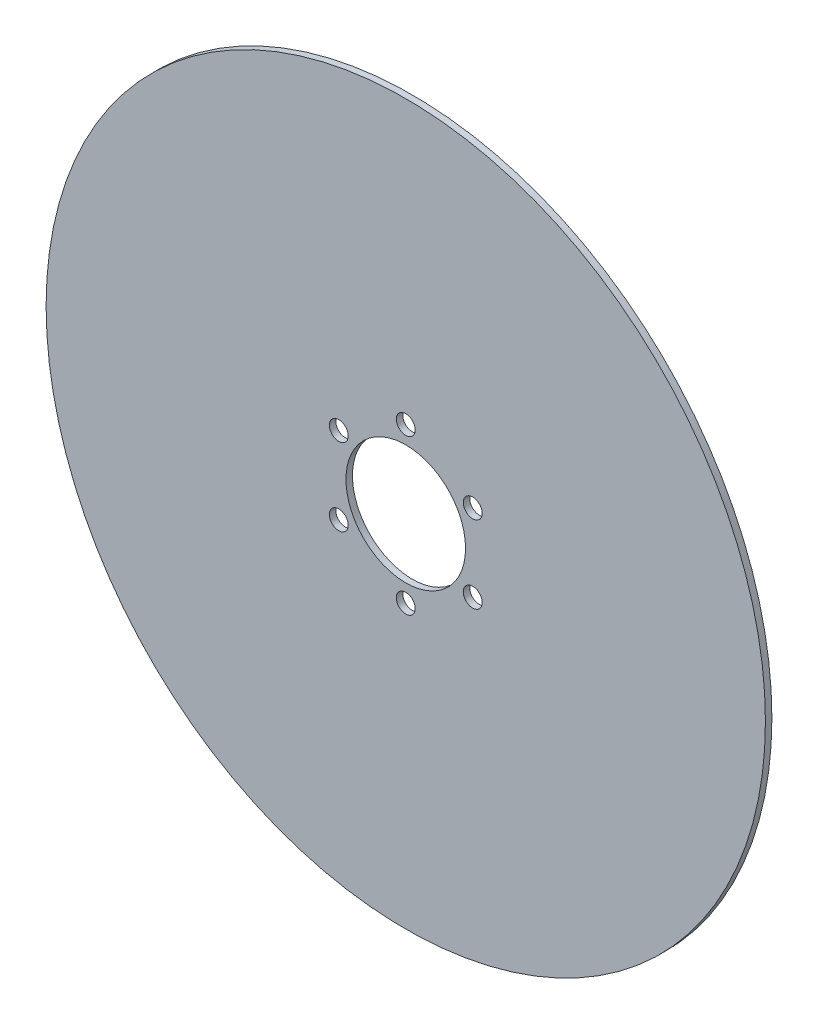
ISO-10303-21;
HEADER;
FILE_DESCRIPTION(('STEP AP214'),'2;1');
FILE_NAME('part.step','',(''),(''),'','','');
FILE_SCHEMA(('AUTOMOTIVE_DESIGN { 1 0 10303 214 1 1 1 1 }'));
ENDSEC;
DATA;
#1=APPLICATION_CONTEXT('core data for automotive mechanical design processes');
#2=APPLICATION_PROTOCOL_DEFINITION('international standard','automotive_design',2000,#1);
#3=PRODUCT_CONTEXT('',#1,'mechanical');
#4=PRODUCT('Part','Part','',(#3));
#5=PRODUCT_RELATED_PRODUCT_CATEGORY('part','',(#4));
#6=PRODUCT_DEFINITION_FORMATION('','',#4);
#7=PRODUCT_DEFINITION_CONTEXT('part definition',#1,'design');
#8=PRODUCT_DEFINITION('design','',#6,#7);
#9=PRODUCT_DEFINITION_SHAPE('','',#8);
#10=(LENGTH_UNIT() NAMED_UNIT(*) SI_UNIT(.MILLI.,.METRE.));
#11=(NAMED_UNIT(*) PLANE_ANGLE_UNIT() SI_UNIT($,.RADIAN.));
#12=(NAMED_UNIT(*) SI_UNIT($,.STERADIAN.) SOLID_ANGLE_UNIT());
#13=UNCERTAINTY_MEASURE_WITH_UNIT(LENGTH_MEASURE(1.E-05),#10,'distance_accuracy_value','');
#14=(GEOMETRIC_REPRESENTATION_CONTEXT(3) GLOBAL_UNCERTAINTY_ASSIGNED_CONTEXT((#13)) GLOBAL_UNIT_ASSIGNED_CONTEXT((#10,
#11,#12)) REPRESENTATION_CONTEXT('',''));
#15=CARTESIAN_POINT('',(0.,0.,0.));
#16=DIRECTION('',(0.,0.,1.));
#17=DIRECTION('',(1.,0.,0.));
#18=AXIS2_PLACEMENT_3D('',#15,#16,#17);
#19=CARTESIAN_POINT('',(0.,0.,-0.9));
#20=DIRECTION('',(0.,0.,1.));
#21=DIRECTION('',(1.,0.,0.));
#22=AXIS2_PLACEMENT_3D('',#19,#20,#21);
#23=CYLINDRICAL_SURFACE('',#22,100.);
#24=CARTESIAN_POINT('',(0.,0.,-0.9));
#25=DIRECTION('',(0.,0.,1.));
#26=DIRECTION('',(1.,0.,0.));
#27=AXIS2_PLACEMENT_3D('',#24,#25,#26);
#28=CIRCLE('',#27,100.);
#29=CARTESIAN_POINT('',(100.,0.,-0.9));
#30=VERTEX_POINT('',#29);
#31=EDGE_CURVE('E10',#30,#30,#28,.T.);
#32=ORIENTED_EDGE('',*,*,#31,.T.);
#33=EDGE_LOOP('',(#32));
#34=FACE_BOUND('',#33,.T.);
#35=CARTESIAN_POINT('',(0.,0.,0.9));
#36=DIRECTION('',(0.,0.,1.));
#37=DIRECTION('',(1.,0.,0.));
#38=AXIS2_PLACEMENT_3D('',#35,#36,#37);
#39=CIRCLE('',#38,100.);
#40=CARTESIAN_POINT('',(100.,0.,0.9));
#41=VERTEX_POINT('',#40);
#42=EDGE_CURVE('E62',#41,#41,#39,.T.);
#43=ORIENTED_EDGE('',*,*,#42,.F.);
#44=EDGE_LOOP('',(#43));
#45=FACE_BOUND('',#44,.T.);
#46=ADVANCED_FACE('F31',(#34,#45),#23,.T.);
#47=CARTESIAN_POINT('',(0.,0.,-0.9));
#48=DIRECTION('',(0.,0.,1.));
#49=DIRECTION('',(1.,0.,0.));
#50=AXIS2_PLACEMENT_3D('',#47,#48,#49);
#51=PLANE('',#50);
#52=CARTESIAN_POINT('',(-18.6195461813654,10.75,-0.9));
#53=DIRECTION('',(0.,0.,1.));
#54=DIRECTION('',(1.,0.,0.));
#55=AXIS2_PLACEMENT_3D('',#52,#53,#54);
#56=CIRCLE('',#55,2.625);
#57=CARTESIAN_POINT('',(-15.9945461813654,10.75,-0.9));
#58=VERTEX_POINT('',#57);
#59=EDGE_CURVE('E59',#58,#58,#56,.T.);
#60=ORIENTED_EDGE('',*,*,#59,.T.);
#61=EDGE_LOOP('',(#60));
#62=FACE_BOUND('',#61,.T.);
#63=CARTESIAN_POINT('',(-18.6195461813654,-10.75,-0.9));
#64=DIRECTION('',(0.,0.,1.));
#65=DIRECTION('',(1.,0.,0.));
#66=AXIS2_PLACEMENT_3D('',#63,#64,#65);
#67=CIRCLE('',#66,2.625);
#68=CARTESIAN_POINT('',(-15.9945461813654,-10.75,-0.9));
#69=VERTEX_POINT('',#68);
#70=EDGE_CURVE('E56',#69,#69,#67,.T.);
#71=ORIENTED_EDGE('',*,*,#70,.T.);
#72=EDGE_LOOP('',(#71));
#73=FACE_BOUND('',#72,.T.);
#74=CARTESIAN_POINT('',(0.,-21.5,-0.9));
#75=DIRECTION('',(0.,0.,1.));
#76=DIRECTION('',(1.,0.,0.));
#77=AXIS2_PLACEMENT_3D('',#74,#75,#76);
#78=CIRCLE('',#77,2.625);
#79=CARTESIAN_POINT('',(2.625,-21.5,-0.9));
#80=VERTEX_POINT('',#79);
#81=EDGE_CURVE('E53',#80,#80,#78,.T.);
#82=ORIENTED_EDGE('',*,*,#81,.T.);
#83=EDGE_LOOP('',(#82));
#84=FACE_BOUND('',#83,.T.);
#85=CARTESIAN_POINT('',(18.6195461813654,-10.75,-0.9));
#86=DIRECTION('',(0.,0.,1.));
#87=DIRECTION('',(1.,0.,0.));
#88=AXIS2_PLACEMENT_3D('',#85,#86,#87);
#89=CIRCLE('',#88,2.625);
#90=CARTESIAN_POINT('',(21.2445461813654,-10.75,-0.9));
#91=VERTEX_POINT('',#90);
#92=EDGE_CURVE('E50',#91,#91,#89,.T.);
#93=ORIENTED_EDGE('',*,*,#92,.T.);
#94=EDGE_LOOP('',(#93));
#95=FACE_BOUND('',#94,.T.);
#96=CARTESIAN_POINT('',(18.6195461813654,10.75,-0.9));
#97=DIRECTION('',(0.,0.,1.));
#98=DIRECTION('',(1.,0.,0.));
#99=AXIS2_PLACEMENT_3D('',#96,#97,#98);
#100=CIRCLE('',#99,2.625);
#101=CARTESIAN_POINT('',(21.2445461813654,10.75,-0.9));
#102=VERTEX_POINT('',#101);
#103=EDGE_CURVE('E45',#102,#102,#100,.T.);
#104=ORIENTED_EDGE('',*,*,#103,.T.);
#105=EDGE_LOOP('',(#104));
#106=FACE_BOUND('',#105,.T.);
#107=CARTESIAN_POINT('',(0.,21.5,-0.9));
#108=DIRECTION('',(0.,0.,1.));
#109=DIRECTION('',(1.,0.,0.));
#110=AXIS2_PLACEMENT_3D('',#107,#108,#109);
#111=CIRCLE('',#110,2.625);
#112=CARTESIAN_POINT('',(2.625,21.5,-0.9));
#113=VERTEX_POINT('',#112);
#114=EDGE_CURVE('E41',#113,#113,#111,.T.);
#115=ORIENTED_EDGE('',*,*,#114,.T.);
#116=EDGE_LOOP('',(#115));
#117=FACE_BOUND('',#116,.T.);
#118=CARTESIAN_POINT('',(0.,0.,-0.9));
#119=DIRECTION('',(0.,0.,1.));
#120=DIRECTION('',(1.,0.,0.));
#121=AXIS2_PLACEMENT_3D('',#118,#119,#120);
#122=CIRCLE('',#121,16.625);
#123=CARTESIAN_POINT('',(16.625,0.,-0.9));
#124=VERTEX_POINT('',#123);
#125=EDGE_CURVE('E37',#124,#124,#122,.T.);
#126=ORIENTED_EDGE('',*,*,#125,.T.);
#127=EDGE_LOOP('',(#126));
#128=FACE_BOUND('',#127,.T.);
#129=ORIENTED_EDGE('',*,*,#31,.F.);
#130=EDGE_LOOP('',(#129));
#131=FACE_BOUND('',#130,.T.);
#132=ADVANCED_FACE('F102',(#62,#73,#84,#95,#106,#117,#128,#131),#51,.F.);
#133=CARTESIAN_POINT('',(0.,0.,-0.9));
#134=DIRECTION('',(0.,0.,1.));
#135=DIRECTION('',(1.,0.,0.));
#136=AXIS2_PLACEMENT_3D('',#133,#134,#135);
#137=CYLINDRICAL_SURFACE('',#136,16.625);
#138=ORIENTED_EDGE('',*,*,#125,.F.);
#139=EDGE_LOOP('',(#138));
#140=FACE_BOUND('',#139,.T.);
#141=CARTESIAN_POINT('',(0.,0.,0.9));
#142=DIRECTION('',(0.,0.,1.));
#143=DIRECTION('',(1.,0.,0.));
#144=AXIS2_PLACEMENT_3D('',#141,#142,#143);
#145=CIRCLE('',#144,16.625);
#146=CARTESIAN_POINT('',(16.625,0.,0.9));
#147=VERTEX_POINT('',#146);
#148=EDGE_CURVE('E65',#147,#147,#145,.T.);
#149=ORIENTED_EDGE('',*,*,#148,.T.);
#150=EDGE_LOOP('',(#149));
#151=FACE_BOUND('',#150,.T.);
#152=ADVANCED_FACE('F106',(#140,#151),#137,.F.);
#153=CARTESIAN_POINT('',(0.,21.5,-0.9));
#154=DIRECTION('',(0.,0.,1.));
#155=DIRECTION('',(1.,0.,0.));
#156=AXIS2_PLACEMENT_3D('',#153,#154,#155);
#157=CYLINDRICAL_SURFACE('',#156,2.625);
#158=ORIENTED_EDGE('',*,*,#114,.F.);
#159=EDGE_LOOP('',(#158));
#160=FACE_BOUND('',#159,.T.);
#161=CARTESIAN_POINT('',(0.,21.5,0.9));
#162=DIRECTION('',(0.,0.,1.));
#163=DIRECTION('',(1.,0.,0.));
#164=AXIS2_PLACEMENT_3D('',#161,#162,#163);
#165=CIRCLE('',#164,2.625);
#166=CARTESIAN_POINT('',(2.625,21.5,0.9));
#167=VERTEX_POINT('',#166);
#168=EDGE_CURVE('E68',#167,#167,#165,.T.);
#169=ORIENTED_EDGE('',*,*,#168,.T.);
#170=EDGE_LOOP('',(#169));
#171=FACE_BOUND('',#170,.T.);
#172=ADVANCED_FACE('F136',(#160,#171),#157,.F.);
#173=CARTESIAN_POINT('',(18.6195461813654,10.75,-0.9));
#174=DIRECTION('',(0.,0.,1.));
#175=DIRECTION('',(1.,0.,0.));
#176=AXIS2_PLACEMENT_3D('',#173,#174,#175);
#177=CYLINDRICAL_SURFACE('',#176,2.625);
#178=ORIENTED_EDGE('',*,*,#103,.F.);
#179=EDGE_LOOP('',(#178));
#180=FACE_BOUND('',#179,.T.);
#181=CARTESIAN_POINT('',(18.6195461813654,10.75,0.9));
#182=DIRECTION('',(0.,0.,1.));
#183=DIRECTION('',(1.,0.,0.));
#184=AXIS2_PLACEMENT_3D('',#181,#182,#183);
#185=CIRCLE('',#184,2.625);
#186=CARTESIAN_POINT('',(21.2445461813654,10.75,0.9));
#187=VERTEX_POINT('',#186);
#188=EDGE_CURVE('E71',#187,#187,#185,.T.);
#189=ORIENTED_EDGE('',*,*,#188,.T.);
#190=EDGE_LOOP('',(#189));
#191=FACE_BOUND('',#190,.T.);
#192=ADVANCED_FACE('F129',(#180,#191),#177,.F.);
#193=CARTESIAN_POINT('',(18.6195461813654,-10.75,-0.9));
#194=DIRECTION('',(0.,0.,1.));
#195=DIRECTION('',(1.,0.,0.));
#196=AXIS2_PLACEMENT_3D('',#193,#194,#195);
#197=CYLINDRICAL_SURFACE('',#196,2.625);
#198=ORIENTED_EDGE('',*,*,#92,.F.);
#199=EDGE_LOOP('',(#198));
#200=FACE_BOUND('',#199,.T.);
#201=CARTESIAN_POINT('',(18.6195461813654,-10.75,0.9));
#202=DIRECTION('',(0.,0.,1.));
#203=DIRECTION('',(1.,0.,0.));
#204=AXIS2_PLACEMENT_3D('',#201,#202,#203);
#205=CIRCLE('',#204,2.625);
#206=CARTESIAN_POINT('',(21.2445461813654,-10.75,0.9));
#207=VERTEX_POINT('',#206);
#208=EDGE_CURVE('E74',#207,#207,#205,.T.);
#209=ORIENTED_EDGE('',*,*,#208,.T.);
#210=EDGE_LOOP('',(#209));
#211=FACE_BOUND('',#210,.T.);
#212=ADVANCED_FACE('F120',(#200,#211),#197,.F.);
#213=CARTESIAN_POINT('',(0.,-21.5,-0.9));
#214=DIRECTION('',(0.,0.,1.));
#215=DIRECTION('',(1.,0.,0.));
#216=AXIS2_PLACEMENT_3D('',#213,#214,#215);
#217=CYLINDRICAL_SURFACE('',#216,2.625);
#218=ORIENTED_EDGE('',*,*,#81,.F.);
#219=EDGE_LOOP('',(#218));
#220=FACE_BOUND('',#219,.T.);
#221=CARTESIAN_POINT('',(0.,-21.5,0.9));
#222=DIRECTION('',(0.,0.,1.));
#223=DIRECTION('',(1.,0.,0.));
#224=AXIS2_PLACEMENT_3D('',#221,#222,#223);
#225=CIRCLE('',#224,2.625);
#226=CARTESIAN_POINT('',(2.625,-21.5,0.9));
#227=VERTEX_POINT('',#226);
#228=EDGE_CURVE('E77',#227,#227,#225,.T.);
#229=ORIENTED_EDGE('',*,*,#228,.T.);
#230=EDGE_LOOP('',(#229));
#231=FACE_BOUND('',#230,.T.);
#232=ADVANCED_FACE('F118',(#220,#231),#217,.F.);
#233=CARTESIAN_POINT('',(-18.6195461813654,-10.75,-0.9));
#234=DIRECTION('',(0.,0.,1.));
#235=DIRECTION('',(1.,0.,0.));
#236=AXIS2_PLACEMENT_3D('',#233,#234,#235);
#237=CYLINDRICAL_SURFACE('',#236,2.625);
#238=ORIENTED_EDGE('',*,*,#70,.F.);
#239=EDGE_LOOP('',(#238));
#240=FACE_BOUND('',#239,.T.);
#241=CARTESIAN_POINT('',(-18.6195461813654,-10.75,0.9));
#242=DIRECTION('',(0.,0.,1.));
#243=DIRECTION('',(1.,0.,0.));
#244=AXIS2_PLACEMENT_3D('',#241,#242,#243);
#245=CIRCLE('',#244,2.625);
#246=CARTESIAN_POINT('',(-15.9945461813654,-10.75,0.9));
#247=VERTEX_POINT('',#246);
#248=EDGE_CURVE('E80',#247,#247,#245,.T.);
#249=ORIENTED_EDGE('',*,*,#248,.T.);
#250=EDGE_LOOP('',(#249));
#251=FACE_BOUND('',#250,.T.);
#252=ADVANCED_FACE('F96',(#240,#251),#237,.F.);
#253=CARTESIAN_POINT('',(-18.6195461813654,10.75,-0.9));
#254=DIRECTION('',(0.,0.,1.));
#255=DIRECTION('',(1.,0.,0.));
#256=AXIS2_PLACEMENT_3D('',#253,#254,#255);
#257=CYLINDRICAL_SURFACE('',#256,2.625);
#258=ORIENTED_EDGE('',*,*,#59,.F.);
#259=EDGE_LOOP('',(#258));
#260=FACE_BOUND('',#259,.T.);
#261=CARTESIAN_POINT('',(-18.6195461813654,10.75,0.9));
#262=DIRECTION('',(0.,0.,1.));
#263=DIRECTION('',(1.,0.,0.));
#264=AXIS2_PLACEMENT_3D('',#261,#262,#263);
#265=CIRCLE('',#264,2.625);
#266=CARTESIAN_POINT('',(-15.9945461813654,10.75,0.9));
#267=VERTEX_POINT('',#266);
#268=EDGE_CURVE('E83',#267,#267,#265,.T.);
#269=ORIENTED_EDGE('',*,*,#268,.T.);
#270=EDGE_LOOP('',(#269));
#271=FACE_BOUND('',#270,.T.);
#272=ADVANCED_FACE('F87',(#260,#271),#257,.F.);
#273=CARTESIAN_POINT('',(0.,0.,0.9));
#274=DIRECTION('',(0.,0.,1.));
#275=DIRECTION('',(1.,0.,0.));
#276=AXIS2_PLACEMENT_3D('',#273,#274,#275);
#277=PLANE('',#276);
#278=ORIENTED_EDGE('',*,*,#248,.F.);
#279=EDGE_LOOP('',(#278));
#280=FACE_BOUND('',#279,.T.);
#281=ORIENTED_EDGE('',*,*,#208,.F.);
#282=EDGE_LOOP('',(#281));
#283=FACE_BOUND('',#282,.T.);
#284=ORIENTED_EDGE('',*,*,#168,.F.);
#285=EDGE_LOOP('',(#284));
#286=FACE_BOUND('',#285,.T.);
#287=ORIENTED_EDGE('',*,*,#42,.T.);
#288=EDGE_LOOP('',(#287));
#289=FACE_BOUND('',#288,.T.);
#290=ORIENTED_EDGE('',*,*,#148,.F.);
#291=EDGE_LOOP('',(#290));
#292=FACE_BOUND('',#291,.T.);
#293=ORIENTED_EDGE('',*,*,#188,.F.);
#294=EDGE_LOOP('',(#293));
#295=FACE_BOUND('',#294,.T.);
#296=ORIENTED_EDGE('',*,*,#228,.F.);
#297=EDGE_LOOP('',(#296));
#298=FACE_BOUND('',#297,.T.);
#299=ORIENTED_EDGE('',*,*,#268,.F.);
#300=EDGE_LOOP('',(#299));
#301=FACE_BOUND('',#300,.T.);
#302=ADVANCED_FACE('F89',(#280,#283,#286,#289,#292,#295,#298,#301),#277,.T.);
#303=CLOSED_SHELL('',(#46,#132,#152,#172,#192,#212,#232,#252,#272,#302));
#304=MANIFOLD_SOLID_BREP('B2',#303);
#305=ADVANCED_BREP_SHAPE_REPRESENTATION('',(#18,#304),#14);
#306=SHAPE_DEFINITION_REPRESENTATION(#9,#305);
ENDSEC;
END-ISO-10303-21;
